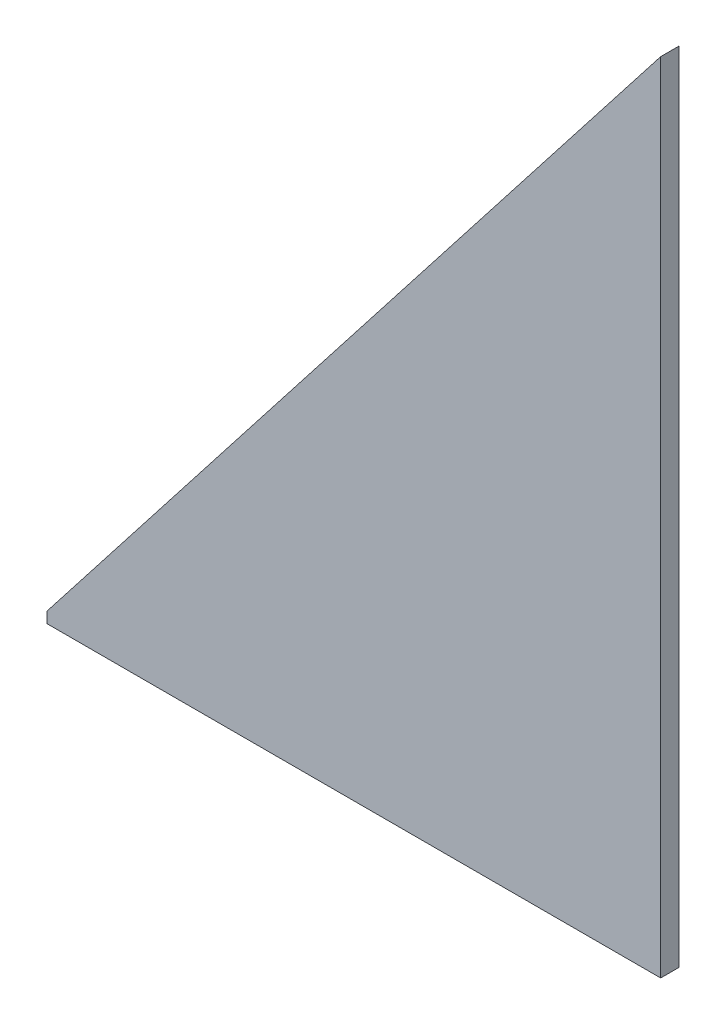
ISO-10303-21;
HEADER;
FILE_DESCRIPTION(('STEP AP214'),'2;1');
FILE_NAME('part.step','',(''),(''),'','','');
FILE_SCHEMA(('AUTOMOTIVE_DESIGN { 1 0 10303 214 1 1 1 1 }'));
ENDSEC;
DATA;
#1=APPLICATION_CONTEXT('core data for automotive mechanical design processes');
#2=APPLICATION_PROTOCOL_DEFINITION('international standard','automotive_design',2000,#1);
#3=PRODUCT_CONTEXT('',#1,'mechanical');
#4=PRODUCT('Part','Part','',(#3));
#5=PRODUCT_RELATED_PRODUCT_CATEGORY('part','',(#4));
#6=PRODUCT_DEFINITION_FORMATION('','',#4);
#7=PRODUCT_DEFINITION_CONTEXT('part definition',#1,'design');
#8=PRODUCT_DEFINITION('design','',#6,#7);
#9=PRODUCT_DEFINITION_SHAPE('','',#8);
#10=(LENGTH_UNIT() NAMED_UNIT(*) SI_UNIT(.MILLI.,.METRE.));
#11=(NAMED_UNIT(*) PLANE_ANGLE_UNIT() SI_UNIT($,.RADIAN.));
#12=(NAMED_UNIT(*) SI_UNIT($,.STERADIAN.) SOLID_ANGLE_UNIT());
#13=UNCERTAINTY_MEASURE_WITH_UNIT(LENGTH_MEASURE(1.E-05),#10,'distance_accuracy_value','');
#14=(GEOMETRIC_REPRESENTATION_CONTEXT(3) GLOBAL_UNCERTAINTY_ASSIGNED_CONTEXT((#13)) GLOBAL_UNIT_ASSIGNED_CONTEXT((#10,
#11,#12)) REPRESENTATION_CONTEXT('',''));
#15=CARTESIAN_POINT('',(0.,0.,0.));
#16=DIRECTION('',(0.,0.,1.));
#17=DIRECTION('',(1.,0.,0.));
#18=AXIS2_PLACEMENT_3D('',#15,#16,#17);
#19=CARTESIAN_POINT('',(-77.8101842599495,30.4568733761812,3.));
#20=DIRECTION('',(1.,0.,0.));
#21=DIRECTION('',(0.,0.,-1.));
#22=AXIS2_PLACEMENT_3D('',#19,#20,#21);
#23=PLANE('',#22);
#24=DIRECTION('',(0.,0.,-1.));
#25=VECTOR('',#24,1.);
#26=CARTESIAN_POINT('',(-77.8101842599495,-97.7896607230012,3.));
#27=LINE('',#26,#25);
#28=CARTESIAN_POINT('',(-77.8101842599495,-97.7896607230012,3.));
#29=VERTEX_POINT('',#28);
#30=CARTESIAN_POINT('',(-77.8101842599495,-97.7896607230012,0.));
#31=VERTEX_POINT('',#30);
#32=EDGE_CURVE('E100',#29,#31,#27,.T.);
#33=ORIENTED_EDGE('',*,*,#32,.T.);
#34=DIRECTION('',(0.,-1.,0.));
#35=VECTOR('',#34,1.);
#36=CARTESIAN_POINT('',(-77.8101842599495,30.4568733761812,0.));
#37=LINE('',#36,#35);
#38=CARTESIAN_POINT('',(-77.8101842599495,-99.5431266238188,0.));
#39=VERTEX_POINT('',#38);
#40=EDGE_CURVE('E91',#31,#39,#37,.T.);
#41=ORIENTED_EDGE('',*,*,#40,.T.);
#42=DIRECTION('',(0.,0.,-1.));
#43=VECTOR('',#42,1.);
#44=CARTESIAN_POINT('',(-77.8101842599495,-99.5431266238188,3.));
#45=LINE('',#44,#43);
#46=CARTESIAN_POINT('',(-77.8101842599495,-99.5431266238188,3.));
#47=VERTEX_POINT('',#46);
#48=EDGE_CURVE('E11',#47,#39,#45,.T.);
#49=ORIENTED_EDGE('',*,*,#48,.F.);
#50=DIRECTION('',(0.,-1.,0.));
#51=VECTOR('',#50,1.);
#52=CARTESIAN_POINT('',(-77.8101842599495,30.4568733761812,3.));
#53=LINE('',#52,#51);
#54=EDGE_CURVE('E94',#29,#47,#53,.T.);
#55=ORIENTED_EDGE('',*,*,#54,.F.);
#56=EDGE_LOOP('',(#33,#41,#49,#55));
#57=FACE_BOUND('',#56,.T.);
#58=ADVANCED_FACE('F37',(#57),#23,.F.);
#59=CARTESIAN_POINT('',(0.,0.,3.));
#60=DIRECTION('',(0.,0.,1.));
#61=DIRECTION('',(1.,0.,0.));
#62=AXIS2_PLACEMENT_3D('',#59,#60,#61);
#63=PLANE('',#62);
#64=DIRECTION('',(0.,1.,0.));
#65=VECTOR('',#64,1.);
#66=CARTESIAN_POINT('',(22.1898157400506,30.4568733761812,3.));
#67=LINE('',#66,#65);
#68=CARTESIAN_POINT('',(22.1898157400506,-99.5431266238188,3.));
#69=VERTEX_POINT('',#68);
#70=CARTESIAN_POINT('',(22.1898157400506,30.4568733761812,3.));
#71=VERTEX_POINT('',#70);
#72=EDGE_CURVE('E84',#69,#71,#67,.T.);
#73=ORIENTED_EDGE('',*,*,#72,.T.);
#74=DIRECTION('',(0.614908317848368,0.788598605528116,0.));
#75=VECTOR('',#74,1.);
#76=CARTESIAN_POINT('',(-77.8101842599495,-97.7896607230012,3.));
#77=LINE('',#76,#75);
#78=EDGE_CURVE('E80',#29,#71,#77,.T.);
#79=ORIENTED_EDGE('',*,*,#78,.F.);
#80=ORIENTED_EDGE('',*,*,#54,.T.);
#81=DIRECTION('',(1.,0.,0.));
#82=VECTOR('',#81,1.);
#83=CARTESIAN_POINT('',(-77.8101842599495,-99.5431266238188,3.));
#84=LINE('',#83,#82);
#85=EDGE_CURVE('E53',#47,#69,#84,.T.);
#86=ORIENTED_EDGE('',*,*,#85,.T.);
#87=EDGE_LOOP('',(#73,#79,#80,#86));
#88=FACE_BOUND('',#87,.T.);
#89=ADVANCED_FACE('F109',(#88),#63,.T.);
#90=CARTESIAN_POINT('',(0.,0.,0.));
#91=DIRECTION('',(0.,0.,1.));
#92=DIRECTION('',(1.,0.,0.));
#93=AXIS2_PLACEMENT_3D('',#90,#91,#92);
#94=PLANE('',#93);
#95=DIRECTION('',(0.614908317848368,0.788598605528116,0.));
#96=VECTOR('',#95,1.);
#97=CARTESIAN_POINT('',(-77.8101842599495,-97.7896607230012,0.));
#98=LINE('',#97,#96);
#99=CARTESIAN_POINT('',(22.1898157400506,30.4568733761812,0.));
#100=VERTEX_POINT('',#99);
#101=EDGE_CURVE('E77',#31,#100,#98,.T.);
#102=ORIENTED_EDGE('',*,*,#101,.T.);
#103=DIRECTION('',(0.,1.,0.));
#104=VECTOR('',#103,1.);
#105=CARTESIAN_POINT('',(22.1898157400506,30.4568733761812,0.));
#106=LINE('',#105,#104);
#107=CARTESIAN_POINT('',(22.1898157400506,-99.5431266238188,0.));
#108=VERTEX_POINT('',#107);
#109=EDGE_CURVE('E90',#108,#100,#106,.T.);
#110=ORIENTED_EDGE('',*,*,#109,.F.);
#111=DIRECTION('',(1.,0.,0.));
#112=VECTOR('',#111,1.);
#113=CARTESIAN_POINT('',(-77.8101842599495,-99.5431266238188,0.));
#114=LINE('',#113,#112);
#115=EDGE_CURVE('E65',#39,#108,#114,.T.);
#116=ORIENTED_EDGE('',*,*,#115,.F.);
#117=ORIENTED_EDGE('',*,*,#40,.F.);
#118=EDGE_LOOP('',(#102,#110,#116,#117));
#119=FACE_BOUND('',#118,.T.);
#120=ADVANCED_FACE('F89',(#119),#94,.F.);
#121=CARTESIAN_POINT('',(-77.8101842599495,-99.5431266238188,3.));
#122=DIRECTION('',(0.,1.,0.));
#123=DIRECTION('',(0.,0.,1.));
#124=AXIS2_PLACEMENT_3D('',#121,#122,#123);
#125=PLANE('',#124);
#126=ORIENTED_EDGE('',*,*,#115,.T.);
#127=DIRECTION('',(0.,0.,-1.));
#128=VECTOR('',#127,1.);
#129=CARTESIAN_POINT('',(22.1898157400506,-99.5431266238188,3.));
#130=LINE('',#129,#128);
#131=EDGE_CURVE('E45',#69,#108,#130,.T.);
#132=ORIENTED_EDGE('',*,*,#131,.F.);
#133=ORIENTED_EDGE('',*,*,#85,.F.);
#134=ORIENTED_EDGE('',*,*,#48,.T.);
#135=EDGE_LOOP('',(#126,#132,#133,#134));
#136=FACE_BOUND('',#135,.T.);
#137=ADVANCED_FACE('F111',(#136),#125,.F.);
#138=CARTESIAN_POINT('',(22.1898157400506,30.4568733761812,3.));
#139=DIRECTION('',(-1.,0.,0.));
#140=DIRECTION('',(0.,-1.,0.));
#141=AXIS2_PLACEMENT_3D('',#138,#139,#140);
#142=PLANE('',#141);
#143=ORIENTED_EDGE('',*,*,#109,.T.);
#144=DIRECTION('',(0.,0.,-1.));
#145=VECTOR('',#144,1.);
#146=CARTESIAN_POINT('',(22.1898157400506,30.4568733761812,3.));
#147=LINE('',#146,#145);
#148=EDGE_CURVE('E72',#71,#100,#147,.T.);
#149=ORIENTED_EDGE('',*,*,#148,.F.);
#150=ORIENTED_EDGE('',*,*,#72,.F.);
#151=ORIENTED_EDGE('',*,*,#131,.T.);
#152=EDGE_LOOP('',(#143,#149,#150,#151));
#153=FACE_BOUND('',#152,.T.);
#154=ADVANCED_FACE('F93',(#153),#142,.F.);
#155=CARTESIAN_POINT('',(-77.8101842599495,-97.7896607230012,3.));
#156=DIRECTION('',(-0.788598605528116,0.614908317848369,0.));
#157=DIRECTION('',(-0.614908317848369,-0.788598605528116,0.));
#158=AXIS2_PLACEMENT_3D('',#155,#156,#157);
#159=PLANE('',#158);
#160=ORIENTED_EDGE('',*,*,#101,.F.);
#161=ORIENTED_EDGE('',*,*,#32,.F.);
#162=ORIENTED_EDGE('',*,*,#78,.T.);
#163=ORIENTED_EDGE('',*,*,#148,.T.);
#164=EDGE_LOOP('',(#160,#161,#162,#163));
#165=FACE_BOUND('',#164,.T.);
#166=ADVANCED_FACE('F74',(#165),#159,.T.);
#167=CLOSED_SHELL('',(#58,#89,#120,#137,#154,#166));
#168=MANIFOLD_SOLID_BREP('B2',#167);
#169=ADVANCED_BREP_SHAPE_REPRESENTATION('',(#18,#168),#14);
#170=SHAPE_DEFINITION_REPRESENTATION(#9,#169);
ENDSEC;
END-ISO-10303-21;
